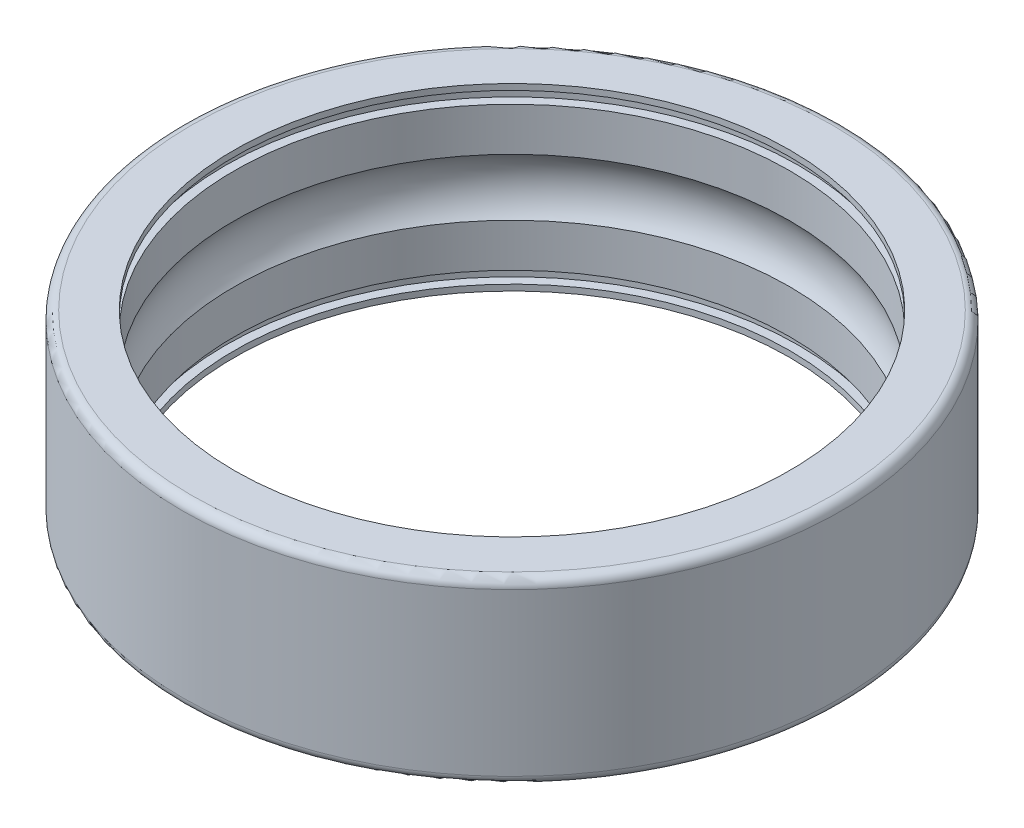
ISO-10303-21;
HEADER;
FILE_DESCRIPTION(('STEP AP214'),'2;1');
FILE_NAME('part.step','',(''),(''),'','','');
FILE_SCHEMA(('AUTOMOTIVE_DESIGN { 1 0 10303 214 1 1 1 1 }'));
ENDSEC;
DATA;
#1=APPLICATION_CONTEXT('core data for automotive mechanical design processes');
#2=APPLICATION_PROTOCOL_DEFINITION('international standard','automotive_design',2000,#1);
#3=PRODUCT_CONTEXT('',#1,'mechanical');
#4=PRODUCT('Part','Part','',(#3));
#5=PRODUCT_RELATED_PRODUCT_CATEGORY('part','',(#4));
#6=PRODUCT_DEFINITION_FORMATION('','',#4);
#7=PRODUCT_DEFINITION_CONTEXT('part definition',#1,'design');
#8=PRODUCT_DEFINITION('design','',#6,#7);
#9=PRODUCT_DEFINITION_SHAPE('','',#8);
#10=(LENGTH_UNIT() NAMED_UNIT(*) SI_UNIT(.MILLI.,.METRE.));
#11=(NAMED_UNIT(*) PLANE_ANGLE_UNIT() SI_UNIT($,.RADIAN.));
#12=(NAMED_UNIT(*) SI_UNIT($,.STERADIAN.) SOLID_ANGLE_UNIT());
#13=UNCERTAINTY_MEASURE_WITH_UNIT(LENGTH_MEASURE(1.E-05),#10,'distance_accuracy_value','');
#14=(GEOMETRIC_REPRESENTATION_CONTEXT(3) GLOBAL_UNCERTAINTY_ASSIGNED_CONTEXT((#13)) GLOBAL_UNIT_ASSIGNED_CONTEXT((#10,
#11,#12)) REPRESENTATION_CONTEXT('',''));
#15=CARTESIAN_POINT('',(0.,0.,0.));
#16=DIRECTION('',(0.,0.,1.));
#17=DIRECTION('',(1.,0.,0.));
#18=AXIS2_PLACEMENT_3D('',#15,#16,#17);
#19=CARTESIAN_POINT('',(0.,-1.65,0.));
#20=DIRECTION('',(0.,1.,0.));
#21=DIRECTION('',(0.,0.,-1.));
#22=AXIS2_PLACEMENT_3D('',#19,#20,#21);
#23=CYLINDRICAL_SURFACE('',#22,4.635);
#24=CARTESIAN_POINT('',(0.,-1.2,0.));
#25=DIRECTION('',(0.,1.,0.));
#26=DIRECTION('',(0.,0.,-1.));
#27=AXIS2_PLACEMENT_3D('',#24,#25,#26);
#28=CIRCLE('',#27,4.635);
#29=CARTESIAN_POINT('',(0.,-1.2,4.635));
#30=VERTEX_POINT('',#29);
#31=EDGE_CURVE('E10',#30,#30,#28,.T.);
#32=ORIENTED_EDGE('',*,*,#31,.F.);
#33=EDGE_LOOP('',(#32));
#34=FACE_BOUND('',#33,.T.);
#35=CARTESIAN_POINT('',(0.,-0.4766665501165,0.));
#36=DIRECTION('',(0.,1.,0.));
#37=DIRECTION('',(0.,0.,-1.));
#38=AXIS2_PLACEMENT_3D('',#35,#36,#37);
#39=CIRCLE('',#38,4.635);
#40=CARTESIAN_POINT('',(0.,-0.4766665501165,-4.635));
#41=VERTEX_POINT('',#40);
#42=EDGE_CURVE('E138',#41,#41,#39,.T.);
#43=ORIENTED_EDGE('',*,*,#42,.T.);
#44=EDGE_LOOP('',(#43));
#45=FACE_BOUND('',#44,.T.);
#46=ADVANCED_FACE('F16',(#34,#45),#23,.F.);
#47=CARTESIAN_POINT('',(0.,-1.2,0.));
#48=DIRECTION('',(0.,1.,0.));
#49=DIRECTION('',(1.,0.,0.));
#50=AXIS2_PLACEMENT_3D('',#47,#48,#49);
#51=PLANE('',#50);
#52=ORIENTED_EDGE('',*,*,#31,.T.);
#53=EDGE_LOOP('',(#52));
#54=FACE_BOUND('',#53,.T.);
#55=CARTESIAN_POINT('',(0.,-1.2,0.));
#56=DIRECTION('',(0.,-1.,0.));
#57=DIRECTION('',(0.,0.,-1.));
#58=AXIS2_PLACEMENT_3D('',#55,#56,#57);
#59=CIRCLE('',#58,4.785);
#60=CARTESIAN_POINT('',(0.,-1.2,4.785));
#61=VERTEX_POINT('',#60);
#62=EDGE_CURVE('E27',#61,#61,#59,.T.);
#63=ORIENTED_EDGE('',*,*,#62,.T.);
#64=EDGE_LOOP('',(#63));
#65=FACE_BOUND('',#64,.T.);
#66=ADVANCED_FACE('F173',(#54,#65),#51,.F.);
#67=CARTESIAN_POINT('',(0.,-1.65,0.));
#68=DIRECTION('',(0.,1.,0.));
#69=DIRECTION('',(0.,0.,-1.));
#70=AXIS2_PLACEMENT_3D('',#67,#68,#69);
#71=CYLINDRICAL_SURFACE('',#70,4.785);
#72=CARTESIAN_POINT('',(0.,-1.4,0.));
#73=DIRECTION('',(0.,1.,0.));
#74=DIRECTION('',(0.,0.,-1.));
#75=AXIS2_PLACEMENT_3D('',#72,#73,#74);
#76=CIRCLE('',#75,4.785);
#77=CARTESIAN_POINT('',(0.,-1.4,4.785));
#78=VERTEX_POINT('',#77);
#79=EDGE_CURVE('E101',#78,#78,#76,.T.);
#80=ORIENTED_EDGE('',*,*,#79,.F.);
#81=EDGE_LOOP('',(#80));
#82=FACE_BOUND('',#81,.T.);
#83=ORIENTED_EDGE('',*,*,#62,.F.);
#84=EDGE_LOOP('',(#83));
#85=FACE_BOUND('',#84,.T.);
#86=ADVANCED_FACE('F179',(#82,#85),#71,.F.);
#87=CARTESIAN_POINT('',(0.,-1.4,0.));
#88=DIRECTION('',(0.,1.,0.));
#89=DIRECTION('',(1.,0.,0.));
#90=AXIS2_PLACEMENT_3D('',#87,#88,#89);
#91=PLANE('',#90);
#92=CARTESIAN_POINT('',(0.,-1.4,0.));
#93=DIRECTION('',(0.,-1.,0.));
#94=DIRECTION('',(0.,0.,-1.));
#95=AXIS2_PLACEMENT_3D('',#92,#93,#94);
#96=CIRCLE('',#95,4.635);
#97=CARTESIAN_POINT('',(0.,-1.4,4.635));
#98=VERTEX_POINT('',#97);
#99=EDGE_CURVE('E96',#98,#98,#96,.T.);
#100=ORIENTED_EDGE('',*,*,#99,.T.);
#101=EDGE_LOOP('',(#100));
#102=FACE_BOUND('',#101,.T.);
#103=ORIENTED_EDGE('',*,*,#79,.T.);
#104=EDGE_LOOP('',(#103));
#105=FACE_BOUND('',#104,.T.);
#106=ADVANCED_FACE('F97',(#102,#105),#91,.T.);
#107=CARTESIAN_POINT('',(0.,-1.65,0.));
#108=DIRECTION('',(0.,1.,0.));
#109=DIRECTION('',(0.,0.,-1.));
#110=AXIS2_PLACEMENT_3D('',#107,#108,#109);
#111=CYLINDRICAL_SURFACE('',#110,4.635);
#112=CARTESIAN_POINT('',(0.,-1.5,0.));
#113=DIRECTION('',(0.,1.,0.));
#114=DIRECTION('',(0.,0.,-1.));
#115=AXIS2_PLACEMENT_3D('',#112,#113,#114);
#116=CIRCLE('',#115,4.635);
#117=CARTESIAN_POINT('',(0.,-1.5,4.635));
#118=VERTEX_POINT('',#117);
#119=EDGE_CURVE('E102',#118,#118,#116,.T.);
#120=ORIENTED_EDGE('',*,*,#119,.F.);
#121=EDGE_LOOP('',(#120));
#122=FACE_BOUND('',#121,.T.);
#123=ORIENTED_EDGE('',*,*,#99,.F.);
#124=EDGE_LOOP('',(#123));
#125=FACE_BOUND('',#124,.T.);
#126=ADVANCED_FACE('F184',(#122,#125),#111,.F.);
#127=CARTESIAN_POINT('',(0.,-1.5,0.));
#128=DIRECTION('',(0.,1.,0.));
#129=DIRECTION('',(1.,0.,0.));
#130=AXIS2_PLACEMENT_3D('',#127,#128,#129);
#131=PLANE('',#130);
#132=ORIENTED_EDGE('',*,*,#119,.T.);
#133=EDGE_LOOP('',(#132));
#134=FACE_BOUND('',#133,.T.);
#135=CARTESIAN_POINT('',(0.,-1.5,0.));
#136=DIRECTION('',(0.,-1.,0.));
#137=DIRECTION('',(0.,0.,-1.));
#138=AXIS2_PLACEMENT_3D('',#135,#136,#137);
#139=CIRCLE('',#138,5.35);
#140=CARTESIAN_POINT('',(0.,-1.5,5.35));
#141=VERTEX_POINT('',#140);
#142=EDGE_CURVE('E20',#141,#141,#139,.T.);
#143=ORIENTED_EDGE('',*,*,#142,.T.);
#144=EDGE_LOOP('',(#143));
#145=FACE_BOUND('',#144,.T.);
#146=ADVANCED_FACE('F18',(#134,#145),#131,.F.);
#147=CARTESIAN_POINT('',(0.,-1.35,0.));
#148=DIRECTION('',(0.,1.,0.));
#149=DIRECTION('',(0.,0.,-1.));
#150=AXIS2_PLACEMENT_3D('',#147,#148,#149);
#151=TOROIDAL_SURFACE('',#150,5.35,0.15);
#152=CARTESIAN_POINT('',(0.,-1.35,0.));
#153=DIRECTION('',(0.,-1.,0.));
#154=DIRECTION('',(0.,0.,-1.));
#155=AXIS2_PLACEMENT_3D('',#152,#153,#154);
#156=CIRCLE('',#155,5.5);
#157=CARTESIAN_POINT('',(0.,-1.35,-5.5));
#158=VERTEX_POINT('',#157);
#159=EDGE_CURVE('E140',#158,#158,#156,.T.);
#160=ORIENTED_EDGE('',*,*,#159,.T.);
#161=EDGE_LOOP('',(#160));
#162=FACE_BOUND('',#161,.T.);
#163=ORIENTED_EDGE('',*,*,#142,.F.);
#164=EDGE_LOOP('',(#163));
#165=FACE_BOUND('',#164,.T.);
#166=ADVANCED_FACE('F246',(#162,#165),#151,.T.);
#167=CARTESIAN_POINT('',(0.,-1.65,0.));
#168=DIRECTION('',(0.,1.,0.));
#169=DIRECTION('',(0.,0.,-1.));
#170=AXIS2_PLACEMENT_3D('',#167,#168,#169);
#171=CYLINDRICAL_SURFACE('',#170,5.5);
#172=ORIENTED_EDGE('',*,*,#159,.F.);
#173=EDGE_LOOP('',(#172));
#174=FACE_BOUND('',#173,.T.);
#175=CARTESIAN_POINT('',(0.,1.35,0.));
#176=DIRECTION('',(0.,-1.,0.));
#177=DIRECTION('',(0.,0.,-1.));
#178=AXIS2_PLACEMENT_3D('',#175,#176,#177);
#179=CIRCLE('',#178,5.5);
#180=CARTESIAN_POINT('',(0.,1.35,5.5));
#181=VERTEX_POINT('',#180);
#182=EDGE_CURVE('E114',#181,#181,#179,.T.);
#183=ORIENTED_EDGE('',*,*,#182,.T.);
#184=EDGE_LOOP('',(#183));
#185=FACE_BOUND('',#184,.T.);
#186=ADVANCED_FACE('F263',(#174,#185),#171,.T.);
#187=CARTESIAN_POINT('',(0.,1.35,0.));
#188=DIRECTION('',(0.,1.,0.));
#189=DIRECTION('',(0.,0.,-1.));
#190=AXIS2_PLACEMENT_3D('',#187,#188,#189);
#191=TOROIDAL_SURFACE('',#190,5.35,0.15);
#192=CARTESIAN_POINT('',(0.,1.5,0.));
#193=DIRECTION('',(0.,1.,0.));
#194=DIRECTION('',(0.,0.,-1.));
#195=AXIS2_PLACEMENT_3D('',#192,#193,#194);
#196=CIRCLE('',#195,5.35);
#197=CARTESIAN_POINT('',(0.,1.5,5.35));
#198=VERTEX_POINT('',#197);
#199=EDGE_CURVE('E112',#198,#198,#196,.T.);
#200=ORIENTED_EDGE('',*,*,#199,.F.);
#201=EDGE_LOOP('',(#200));
#202=FACE_BOUND('',#201,.T.);
#203=ORIENTED_EDGE('',*,*,#182,.F.);
#204=EDGE_LOOP('',(#203));
#205=FACE_BOUND('',#204,.T.);
#206=ADVANCED_FACE('F275',(#202,#205),#191,.T.);
#207=CARTESIAN_POINT('',(0.,1.5,0.));
#208=DIRECTION('',(0.,1.,0.));
#209=DIRECTION('',(1.,0.,0.));
#210=AXIS2_PLACEMENT_3D('',#207,#208,#209);
#211=PLANE('',#210);
#212=CARTESIAN_POINT('',(0.,1.5,0.));
#213=DIRECTION('',(0.,-1.,0.));
#214=DIRECTION('',(0.,0.,-1.));
#215=AXIS2_PLACEMENT_3D('',#212,#213,#214);
#216=CIRCLE('',#215,4.635);
#217=CARTESIAN_POINT('',(0.,1.5,4.635));
#218=VERTEX_POINT('',#217);
#219=EDGE_CURVE('E115',#218,#218,#216,.T.);
#220=ORIENTED_EDGE('',*,*,#219,.T.);
#221=EDGE_LOOP('',(#220));
#222=FACE_BOUND('',#221,.T.);
#223=ORIENTED_EDGE('',*,*,#199,.T.);
#224=EDGE_LOOP('',(#223));
#225=FACE_BOUND('',#224,.T.);
#226=ADVANCED_FACE('F286',(#222,#225),#211,.T.);
#227=CARTESIAN_POINT('',(0.,-1.65,0.));
#228=DIRECTION('',(0.,1.,0.));
#229=DIRECTION('',(0.,0.,-1.));
#230=AXIS2_PLACEMENT_3D('',#227,#228,#229);
#231=CYLINDRICAL_SURFACE('',#230,4.635);
#232=CARTESIAN_POINT('',(0.,1.4,0.));
#233=DIRECTION('',(0.,1.,0.));
#234=DIRECTION('',(0.,0.,-1.));
#235=AXIS2_PLACEMENT_3D('',#232,#233,#234);
#236=CIRCLE('',#235,4.635);
#237=CARTESIAN_POINT('',(0.,1.4,4.635));
#238=VERTEX_POINT('',#237);
#239=EDGE_CURVE('E123',#238,#238,#236,.T.);
#240=ORIENTED_EDGE('',*,*,#239,.F.);
#241=EDGE_LOOP('',(#240));
#242=FACE_BOUND('',#241,.T.);
#243=ORIENTED_EDGE('',*,*,#219,.F.);
#244=EDGE_LOOP('',(#243));
#245=FACE_BOUND('',#244,.T.);
#246=ADVANCED_FACE('F297',(#242,#245),#231,.F.);
#247=CARTESIAN_POINT('',(0.,1.4,0.));
#248=DIRECTION('',(0.,1.,0.));
#249=DIRECTION('',(1.,0.,0.));
#250=AXIS2_PLACEMENT_3D('',#247,#248,#249);
#251=PLANE('',#250);
#252=ORIENTED_EDGE('',*,*,#239,.T.);
#253=EDGE_LOOP('',(#252));
#254=FACE_BOUND('',#253,.T.);
#255=CARTESIAN_POINT('',(0.,1.4,0.));
#256=DIRECTION('',(0.,-1.,0.));
#257=DIRECTION('',(0.,0.,-1.));
#258=AXIS2_PLACEMENT_3D('',#255,#256,#257);
#259=CIRCLE('',#258,4.785);
#260=CARTESIAN_POINT('',(0.,1.4,4.785));
#261=VERTEX_POINT('',#260);
#262=EDGE_CURVE('E119',#261,#261,#259,.T.);
#263=ORIENTED_EDGE('',*,*,#262,.T.);
#264=EDGE_LOOP('',(#263));
#265=FACE_BOUND('',#264,.T.);
#266=ADVANCED_FACE('F308',(#254,#265),#251,.F.);
#267=CARTESIAN_POINT('',(0.,-1.65,0.));
#268=DIRECTION('',(0.,1.,0.));
#269=DIRECTION('',(0.,0.,-1.));
#270=AXIS2_PLACEMENT_3D('',#267,#268,#269);
#271=CYLINDRICAL_SURFACE('',#270,4.785);
#272=CARTESIAN_POINT('',(0.,1.2,0.));
#273=DIRECTION('',(0.,1.,0.));
#274=DIRECTION('',(0.,0.,-1.));
#275=AXIS2_PLACEMENT_3D('',#272,#273,#274);
#276=CIRCLE('',#275,4.785);
#277=CARTESIAN_POINT('',(0.,1.2,4.785));
#278=VERTEX_POINT('',#277);
#279=EDGE_CURVE('E116',#278,#278,#276,.T.);
#280=ORIENTED_EDGE('',*,*,#279,.F.);
#281=EDGE_LOOP('',(#280));
#282=FACE_BOUND('',#281,.T.);
#283=ORIENTED_EDGE('',*,*,#262,.F.);
#284=EDGE_LOOP('',(#283));
#285=FACE_BOUND('',#284,.T.);
#286=ADVANCED_FACE('F318',(#282,#285),#271,.F.);
#287=CARTESIAN_POINT('',(0.,1.2,0.));
#288=DIRECTION('',(0.,1.,0.));
#289=DIRECTION('',(1.,0.,0.));
#290=AXIS2_PLACEMENT_3D('',#287,#288,#289);
#291=PLANE('',#290);
#292=CARTESIAN_POINT('',(0.,1.2,0.));
#293=DIRECTION('',(0.,-1.,0.));
#294=DIRECTION('',(0.,0.,-1.));
#295=AXIS2_PLACEMENT_3D('',#292,#293,#294);
#296=CIRCLE('',#295,4.635);
#297=CARTESIAN_POINT('',(0.,1.2,-4.635));
#298=VERTEX_POINT('',#297);
#299=EDGE_CURVE('E120',#298,#298,#296,.T.);
#300=ORIENTED_EDGE('',*,*,#299,.T.);
#301=EDGE_LOOP('',(#300));
#302=FACE_BOUND('',#301,.T.);
#303=ORIENTED_EDGE('',*,*,#279,.T.);
#304=EDGE_LOOP('',(#303));
#305=FACE_BOUND('',#304,.T.);
#306=ADVANCED_FACE('F168',(#302,#305),#291,.T.);
#307=CARTESIAN_POINT('',(0.,-1.65,0.));
#308=DIRECTION('',(0.,1.,0.));
#309=DIRECTION('',(0.,0.,-1.));
#310=AXIS2_PLACEMENT_3D('',#307,#308,#309);
#311=CYLINDRICAL_SURFACE('',#310,4.635);
#312=ORIENTED_EDGE('',*,*,#299,.F.);
#313=EDGE_LOOP('',(#312));
#314=FACE_BOUND('',#313,.T.);
#315=CARTESIAN_POINT('',(0.,0.4766665501165,0.));
#316=DIRECTION('',(0.,-1.,0.));
#317=DIRECTION('',(0.,0.,-1.));
#318=AXIS2_PLACEMENT_3D('',#315,#316,#317);
#319=CIRCLE('',#318,4.635);
#320=CARTESIAN_POINT('',(0.,0.4766665501165,4.635));
#321=VERTEX_POINT('',#320);
#322=EDGE_CURVE('E151',#321,#321,#319,.T.);
#323=ORIENTED_EDGE('',*,*,#322,.T.);
#324=EDGE_LOOP('',(#323));
#325=FACE_BOUND('',#324,.T.);
#326=ADVANCED_FACE('F163',(#314,#325),#311,.F.);
#327=CARTESIAN_POINT('',(0.,0.,0.));
#328=DIRECTION('',(0.,1.,0.));
#329=DIRECTION('',(0.,0.,-1.));
#330=AXIS2_PLACEMENT_3D('',#327,#328,#329);
#331=TOROIDAL_SURFACE('',#330,4.,0.794);
#332=ORIENTED_EDGE('',*,*,#42,.F.);
#333=EDGE_LOOP('',(#332));
#334=FACE_BOUND('',#333,.T.);
#335=ORIENTED_EDGE('',*,*,#322,.F.);
#336=EDGE_LOOP('',(#335));
#337=FACE_BOUND('',#336,.T.);
#338=ADVANCED_FACE('F160',(#334,#337),#331,.F.);
#339=CLOSED_SHELL('',(#46,#66,#86,#106,#126,#146,#166,#186,#206,#226,#246,#266,#286,#306,#326,#338));
#340=MANIFOLD_SOLID_BREP('B1',#339);
#341=ADVANCED_BREP_SHAPE_REPRESENTATION('',(#18,#340),#14);
#342=SHAPE_DEFINITION_REPRESENTATION(#9,#341);
ENDSEC;
END-ISO-10303-21;
